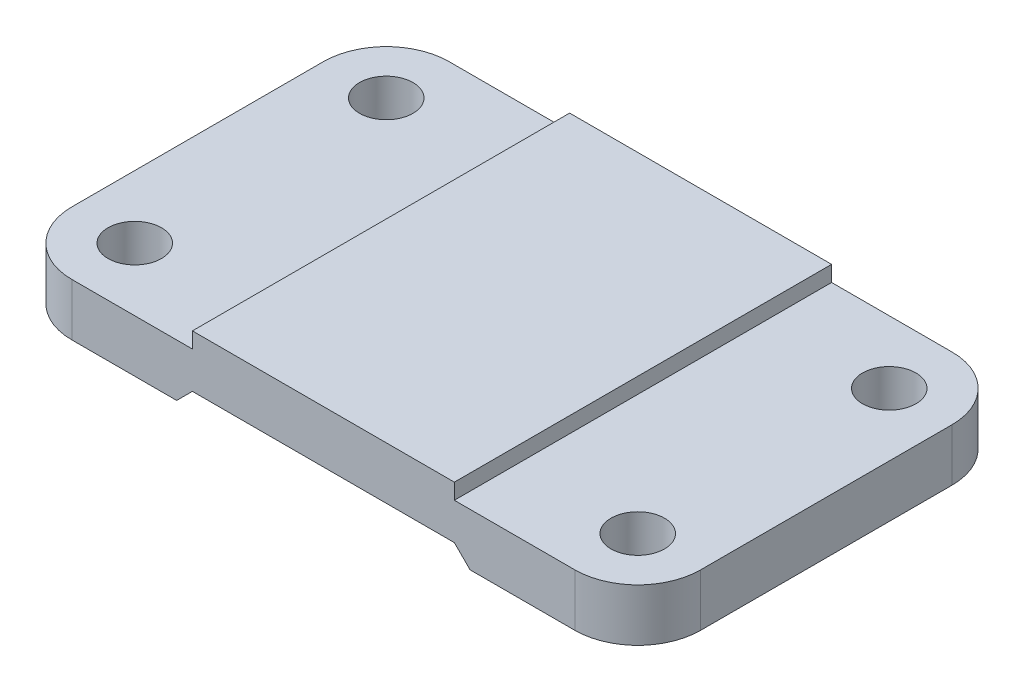
ISO-10303-21;
HEADER;
FILE_DESCRIPTION(('STEP AP214'),'2;1');
FILE_NAME('part.step','',(''),(''),'','','');
FILE_SCHEMA(('AUTOMOTIVE_DESIGN { 1 0 10303 214 1 1 1 1 }'));
ENDSEC;
DATA;
#1=APPLICATION_CONTEXT('core data for automotive mechanical design processes');
#2=APPLICATION_PROTOCOL_DEFINITION('international standard','automotive_design',2000,#1);
#3=PRODUCT_CONTEXT('',#1,'mechanical');
#4=PRODUCT('Part','Part','',(#3));
#5=PRODUCT_RELATED_PRODUCT_CATEGORY('part','',(#4));
#6=PRODUCT_DEFINITION_FORMATION('','',#4);
#7=PRODUCT_DEFINITION_CONTEXT('part definition',#1,'design');
#8=PRODUCT_DEFINITION('design','',#6,#7);
#9=PRODUCT_DEFINITION_SHAPE('','',#8);
#10=(LENGTH_UNIT() NAMED_UNIT(*) SI_UNIT(.MILLI.,.METRE.));
#11=(NAMED_UNIT(*) PLANE_ANGLE_UNIT() SI_UNIT($,.RADIAN.));
#12=(NAMED_UNIT(*) SI_UNIT($,.STERADIAN.) SOLID_ANGLE_UNIT());
#13=UNCERTAINTY_MEASURE_WITH_UNIT(LENGTH_MEASURE(1.E-05),#10,'distance_accuracy_value','');
#14=(GEOMETRIC_REPRESENTATION_CONTEXT(3) GLOBAL_UNCERTAINTY_ASSIGNED_CONTEXT((#13)) GLOBAL_UNIT_ASSIGNED_CONTEXT((#10,
#11,#12)) REPRESENTATION_CONTEXT('',''));
#15=CARTESIAN_POINT('',(0.,0.,0.));
#16=DIRECTION('',(0.,0.,1.));
#17=DIRECTION('',(1.,0.,0.));
#18=AXIS2_PLACEMENT_3D('',#15,#16,#17);
#19=CARTESIAN_POINT('',(0.,3.5,72.));
#20=DIRECTION('',(0.,1.,0.));
#21=DIRECTION('',(-1.,0.,0.));
#22=AXIS2_PLACEMENT_3D('',#19,#20,#21);
#23=PLANE('',#22);
#24=CARTESIAN_POINT('',(-48.,3.5,12.));
#25=DIRECTION('',(0.,1.,0.));
#26=DIRECTION('',(0.,0.,1.));
#27=AXIS2_PLACEMENT_3D('',#24,#25,#26);
#28=CIRCLE('',#27,5.09999999999999);
#29=CARTESIAN_POINT('',(-48.,3.5,17.1));
#30=VERTEX_POINT('',#29);
#31=EDGE_CURVE('E384',#30,#30,#28,.T.);
#32=ORIENTED_EDGE('',*,*,#31,.F.);
#33=EDGE_LOOP('',(#32));
#34=FACE_BOUND('',#33,.T.);
#35=CARTESIAN_POINT('',(-48.,3.5,60.));
#36=DIRECTION('',(0.,1.,0.));
#37=DIRECTION('',(0.,0.,1.));
#38=AXIS2_PLACEMENT_3D('',#35,#36,#37);
#39=CIRCLE('',#38,5.09999999999999);
#40=CARTESIAN_POINT('',(-48.,3.5,65.1));
#41=VERTEX_POINT('',#40);
#42=EDGE_CURVE('E376',#41,#41,#39,.T.);
#43=ORIENTED_EDGE('',*,*,#42,.F.);
#44=EDGE_LOOP('',(#43));
#45=FACE_BOUND('',#44,.T.);
#46=DIRECTION('',(1.,0.,0.));
#47=VECTOR('',#46,1.);
#48=CARTESIAN_POINT('',(0.,3.5,0.));
#49=LINE('',#48,#47);
#50=CARTESIAN_POINT('',(-48.,3.5,0.));
#51=VERTEX_POINT('',#50);
#52=CARTESIAN_POINT('',(-25.,3.5,0.));
#53=VERTEX_POINT('',#52);
#54=EDGE_CURVE('E216',#51,#53,#49,.T.);
#55=ORIENTED_EDGE('',*,*,#54,.F.);
#56=CARTESIAN_POINT('',(-48.,3.5,12.));
#57=DIRECTION('',(0.,1.,0.));
#58=DIRECTION('',(-1.,0.,0.));
#59=AXIS2_PLACEMENT_3D('',#56,#57,#58);
#60=CIRCLE('',#59,12.);
#61=CARTESIAN_POINT('',(-60.,3.5,12.));
#62=VERTEX_POINT('',#61);
#63=EDGE_CURVE('E294',#51,#62,#60,.T.);
#64=ORIENTED_EDGE('',*,*,#63,.T.);
#65=DIRECTION('',(0.,0.,-1.));
#66=VECTOR('',#65,1.);
#67=CARTESIAN_POINT('',(-60.,3.5,72.));
#68=LINE('',#67,#66);
#69=CARTESIAN_POINT('',(-60.,3.5,60.));
#70=VERTEX_POINT('',#69);
#71=EDGE_CURVE('E280',#70,#62,#68,.T.);
#72=ORIENTED_EDGE('',*,*,#71,.F.);
#73=CARTESIAN_POINT('',(-48.,3.5,60.));
#74=DIRECTION('',(0.,1.,0.));
#75=DIRECTION('',(-1.,0.,0.));
#76=AXIS2_PLACEMENT_3D('',#73,#74,#75);
#77=CIRCLE('',#76,12.);
#78=CARTESIAN_POINT('',(-48.,3.5,72.));
#79=VERTEX_POINT('',#78);
#80=EDGE_CURVE('E291',#70,#79,#77,.T.);
#81=ORIENTED_EDGE('',*,*,#80,.T.);
#82=DIRECTION('',(1.,0.,0.));
#83=VECTOR('',#82,1.);
#84=CARTESIAN_POINT('',(0.,3.5,72.));
#85=LINE('',#84,#83);
#86=CARTESIAN_POINT('',(-25.,3.5,72.));
#87=VERTEX_POINT('',#86);
#88=EDGE_CURVE('E173',#79,#87,#85,.T.);
#89=ORIENTED_EDGE('',*,*,#88,.T.);
#90=DIRECTION('',(0.,0.,-1.));
#91=VECTOR('',#90,1.);
#92=CARTESIAN_POINT('',(-25.,3.5,72.));
#93=LINE('',#92,#91);
#94=EDGE_CURVE('E215',#87,#53,#93,.T.);
#95=ORIENTED_EDGE('',*,*,#94,.T.);
#96=EDGE_LOOP('',(#55,#64,#72,#81,#89,#95));
#97=FACE_BOUND('',#96,.T.);
#98=ADVANCED_FACE('F47',(#34,#45,#97),#23,.T.);
#99=CARTESIAN_POINT('',(-60.,0.,72.));
#100=DIRECTION('',(-1.,0.,0.));
#101=DIRECTION('',(0.,0.,1.));
#102=AXIS2_PLACEMENT_3D('',#99,#100,#101);
#103=PLANE('',#102);
#104=ORIENTED_EDGE('',*,*,#71,.T.);
#105=DIRECTION('',(0.,1.,0.));
#106=VECTOR('',#105,1.);
#107=CARTESIAN_POINT('',(-60.,-6.5,12.));
#108=LINE('',#107,#106);
#109=CARTESIAN_POINT('',(-60.,-6.5,12.));
#110=VERTEX_POINT('',#109);
#111=EDGE_CURVE('E301',#62,#110,#108,.F.);
#112=ORIENTED_EDGE('',*,*,#111,.T.);
#113=DIRECTION('',(0.,0.,-1.));
#114=VECTOR('',#113,1.);
#115=CARTESIAN_POINT('',(-60.,-6.5,72.));
#116=LINE('',#115,#114);
#117=CARTESIAN_POINT('',(-60.,-6.5,60.));
#118=VERTEX_POINT('',#117);
#119=EDGE_CURVE('E184',#118,#110,#116,.T.);
#120=ORIENTED_EDGE('',*,*,#119,.F.);
#121=DIRECTION('',(0.,1.,0.));
#122=VECTOR('',#121,1.);
#123=CARTESIAN_POINT('',(-60.,0.,60.));
#124=LINE('',#123,#122);
#125=EDGE_CURVE('E297',#118,#70,#124,.T.);
#126=ORIENTED_EDGE('',*,*,#125,.T.);
#127=EDGE_LOOP('',(#104,#112,#120,#126));
#128=FACE_BOUND('',#127,.T.);
#129=ADVANCED_FACE('F395',(#128),#103,.T.);
#130=CARTESIAN_POINT('',(0.,-6.5,72.));
#131=DIRECTION('',(0.,1.,0.));
#132=DIRECTION('',(-1.,0.,0.));
#133=AXIS2_PLACEMENT_3D('',#130,#131,#132);
#134=PLANE('',#133);
#135=CARTESIAN_POINT('',(-48.,-6.5,12.));
#136=DIRECTION('',(0.,1.,0.));
#137=DIRECTION('',(-1.,0.,0.));
#138=AXIS2_PLACEMENT_3D('',#135,#136,#137);
#139=CIRCLE('',#138,5.09999999999999);
#140=CARTESIAN_POINT('',(-53.1,-6.5,12.));
#141=VERTEX_POINT('',#140);
#142=EDGE_CURVE('E380',#141,#141,#139,.T.);
#143=ORIENTED_EDGE('',*,*,#142,.T.);
#144=EDGE_LOOP('',(#143));
#145=FACE_BOUND('',#144,.T.);
#146=CARTESIAN_POINT('',(-48.,-6.5,60.));
#147=DIRECTION('',(0.,1.,0.));
#148=DIRECTION('',(-1.,0.,0.));
#149=AXIS2_PLACEMENT_3D('',#146,#147,#148);
#150=CIRCLE('',#149,5.09999999999999);
#151=CARTESIAN_POINT('',(-53.1,-6.5,60.));
#152=VERTEX_POINT('',#151);
#153=EDGE_CURVE('E372',#152,#152,#150,.T.);
#154=ORIENTED_EDGE('',*,*,#153,.T.);
#155=EDGE_LOOP('',(#154));
#156=FACE_BOUND('',#155,.T.);
#157=ORIENTED_EDGE('',*,*,#119,.T.);
#158=CARTESIAN_POINT('',(-48.,-6.5,12.));
#159=DIRECTION('',(0.,1.,0.));
#160=DIRECTION('',(-1.,0.,0.));
#161=AXIS2_PLACEMENT_3D('',#158,#159,#160);
#162=CIRCLE('',#161,12.);
#163=CARTESIAN_POINT('',(-48.,-6.5,0.));
#164=VERTEX_POINT('',#163);
#165=EDGE_CURVE('E307',#110,#164,#162,.F.);
#166=ORIENTED_EDGE('',*,*,#165,.T.);
#167=DIRECTION('',(1.,0.,0.));
#168=VECTOR('',#167,1.);
#169=CARTESIAN_POINT('',(0.,-6.5,0.));
#170=LINE('',#169,#168);
#171=CARTESIAN_POINT('',(-28.,-6.5,0.));
#172=VERTEX_POINT('',#171);
#173=EDGE_CURVE('E180',#164,#172,#170,.T.);
#174=ORIENTED_EDGE('',*,*,#173,.T.);
#175=DIRECTION('',(0.,0.,-1.));
#176=VECTOR('',#175,1.);
#177=CARTESIAN_POINT('',(-28.,-6.5,72.));
#178=LINE('',#177,#176);
#179=CARTESIAN_POINT('',(-28.,-6.5,72.));
#180=VERTEX_POINT('',#179);
#181=EDGE_CURVE('E176',#180,#172,#178,.T.);
#182=ORIENTED_EDGE('',*,*,#181,.F.);
#183=DIRECTION('',(1.,0.,0.));
#184=VECTOR('',#183,1.);
#185=CARTESIAN_POINT('',(0.,-6.5,72.));
#186=LINE('',#185,#184);
#187=CARTESIAN_POINT('',(-48.,-6.5,72.));
#188=VERTEX_POINT('',#187);
#189=EDGE_CURVE('E162',#188,#180,#186,.T.);
#190=ORIENTED_EDGE('',*,*,#189,.F.);
#191=CARTESIAN_POINT('',(-48.,-6.5,60.));
#192=DIRECTION('',(0.,1.,0.));
#193=DIRECTION('',(-1.,0.,0.));
#194=AXIS2_PLACEMENT_3D('',#191,#192,#193);
#195=CIRCLE('',#194,12.);
#196=EDGE_CURVE('E304',#188,#118,#195,.F.);
#197=ORIENTED_EDGE('',*,*,#196,.T.);
#198=EDGE_LOOP('',(#157,#166,#174,#182,#190,#197));
#199=FACE_BOUND('',#198,.T.);
#200=ADVANCED_FACE('F178',(#145,#156,#199),#134,.F.);
#201=CARTESIAN_POINT('',(-10.7500000000001,10.75,72.));
#202=DIRECTION('',(-0.707106781186551,0.707106781186544,0.));
#203=DIRECTION('',(-0.707106781186544,-0.707106781186551,0.));
#204=AXIS2_PLACEMENT_3D('',#201,#202,#203);
#205=PLANE('',#204);
#206=DIRECTION('',(0.707106781186544,0.707106781186551,0.));
#207=VECTOR('',#206,1.);
#208=CARTESIAN_POINT('',(-10.7500000000001,10.75,0.));
#209=LINE('',#208,#207);
#210=CARTESIAN_POINT('',(-25.,-3.49999999999999,0.));
#211=VERTEX_POINT('',#210);
#212=EDGE_CURVE('E223',#172,#211,#209,.T.);
#213=ORIENTED_EDGE('',*,*,#212,.T.);
#214=DIRECTION('',(0.,0.,-1.));
#215=VECTOR('',#214,1.);
#216=CARTESIAN_POINT('',(-25.,-3.49999999999999,72.));
#217=LINE('',#216,#215);
#218=CARTESIAN_POINT('',(-25.,-3.49999999999999,72.));
#219=VERTEX_POINT('',#218);
#220=EDGE_CURVE('E185',#219,#211,#217,.T.);
#221=ORIENTED_EDGE('',*,*,#220,.F.);
#222=DIRECTION('',(0.707106781186544,0.707106781186551,0.));
#223=VECTOR('',#222,1.);
#224=CARTESIAN_POINT('',(-10.7500000000001,10.75,72.));
#225=LINE('',#224,#223);
#226=EDGE_CURVE('E167',#180,#219,#225,.T.);
#227=ORIENTED_EDGE('',*,*,#226,.F.);
#228=ORIENTED_EDGE('',*,*,#181,.T.);
#229=EDGE_LOOP('',(#213,#221,#227,#228));
#230=FACE_BOUND('',#229,.T.);
#231=ADVANCED_FACE('F187',(#230),#205,.F.);
#232=CARTESIAN_POINT('',(0.,-3.49999999999999,72.));
#233=DIRECTION('',(0.,1.,0.));
#234=DIRECTION('',(-1.,0.,0.));
#235=AXIS2_PLACEMENT_3D('',#232,#233,#234);
#236=PLANE('',#235);
#237=DIRECTION('',(1.,0.,0.));
#238=VECTOR('',#237,1.);
#239=CARTESIAN_POINT('',(0.,-3.49999999999999,0.));
#240=LINE('',#239,#238);
#241=CARTESIAN_POINT('',(25.,-3.49999999999999,0.));
#242=VERTEX_POINT('',#241);
#243=EDGE_CURVE('E226',#211,#242,#240,.T.);
#244=ORIENTED_EDGE('',*,*,#243,.T.);
#245=DIRECTION('',(0.,0.,-1.));
#246=VECTOR('',#245,1.);
#247=CARTESIAN_POINT('',(25.,-3.49999999999999,72.));
#248=LINE('',#247,#246);
#249=CARTESIAN_POINT('',(25.,-3.49999999999999,72.));
#250=VERTEX_POINT('',#249);
#251=EDGE_CURVE('E272',#250,#242,#248,.T.);
#252=ORIENTED_EDGE('',*,*,#251,.F.);
#253=DIRECTION('',(1.,0.,0.));
#254=VECTOR('',#253,1.);
#255=CARTESIAN_POINT('',(0.,-3.49999999999999,72.));
#256=LINE('',#255,#254);
#257=EDGE_CURVE('E191',#219,#250,#256,.T.);
#258=ORIENTED_EDGE('',*,*,#257,.F.);
#259=ORIENTED_EDGE('',*,*,#220,.T.);
#260=EDGE_LOOP('',(#244,#252,#258,#259));
#261=FACE_BOUND('',#260,.T.);
#262=ADVANCED_FACE('F413',(#261),#236,.F.);
#263=CARTESIAN_POINT('',(10.75,10.75,72.));
#264=DIRECTION('',(0.707106781186549,0.707106781186546,0.));
#265=DIRECTION('',(-0.707106781186546,0.707106781186549,0.));
#266=AXIS2_PLACEMENT_3D('',#263,#264,#265);
#267=PLANE('',#266);
#268=DIRECTION('',(0.707106781186546,-0.707106781186549,0.));
#269=VECTOR('',#268,1.);
#270=CARTESIAN_POINT('',(10.75,10.75,0.));
#271=LINE('',#270,#269);
#272=CARTESIAN_POINT('',(28.,-6.49999999999999,0.));
#273=VERTEX_POINT('',#272);
#274=EDGE_CURVE('E229',#242,#273,#271,.T.);
#275=ORIENTED_EDGE('',*,*,#274,.T.);
#276=DIRECTION('',(0.,0.,-1.));
#277=VECTOR('',#276,1.);
#278=CARTESIAN_POINT('',(28.,-6.49999999999999,72.));
#279=LINE('',#278,#277);
#280=CARTESIAN_POINT('',(28.,-6.49999999999999,72.));
#281=VERTEX_POINT('',#280);
#282=EDGE_CURVE('E268',#281,#273,#279,.T.);
#283=ORIENTED_EDGE('',*,*,#282,.F.);
#284=DIRECTION('',(0.707106781186546,-0.707106781186549,0.));
#285=VECTOR('',#284,1.);
#286=CARTESIAN_POINT('',(10.75,10.75,72.));
#287=LINE('',#286,#285);
#288=EDGE_CURVE('E194',#250,#281,#287,.T.);
#289=ORIENTED_EDGE('',*,*,#288,.F.);
#290=ORIENTED_EDGE('',*,*,#251,.T.);
#291=EDGE_LOOP('',(#275,#283,#289,#290));
#292=FACE_BOUND('',#291,.T.);
#293=ADVANCED_FACE('F444',(#292),#267,.F.);
#294=CARTESIAN_POINT('',(0.,-6.49999999999998,72.));
#295=DIRECTION('',(0.,1.,0.));
#296=DIRECTION('',(-1.,0.,0.));
#297=AXIS2_PLACEMENT_3D('',#294,#295,#296);
#298=PLANE('',#297);
#299=CARTESIAN_POINT('',(48.,-6.5,60.));
#300=DIRECTION('',(0.,1.,0.));
#301=DIRECTION('',(-1.,0.,0.));
#302=AXIS2_PLACEMENT_3D('',#299,#300,#301);
#303=CIRCLE('',#302,5.09999999999999);
#304=CARTESIAN_POINT('',(42.9,-6.5,60.));
#305=VERTEX_POINT('',#304);
#306=EDGE_CURVE('E364',#305,#305,#303,.T.);
#307=ORIENTED_EDGE('',*,*,#306,.T.);
#308=EDGE_LOOP('',(#307));
#309=FACE_BOUND('',#308,.T.);
#310=CARTESIAN_POINT('',(48.,-6.5,12.));
#311=DIRECTION('',(0.,1.,0.));
#312=DIRECTION('',(-1.,0.,0.));
#313=AXIS2_PLACEMENT_3D('',#310,#311,#312);
#314=CIRCLE('',#313,5.09999999999999);
#315=CARTESIAN_POINT('',(42.9,-6.5,12.));
#316=VERTEX_POINT('',#315);
#317=EDGE_CURVE('E219',#316,#316,#314,.T.);
#318=ORIENTED_EDGE('',*,*,#317,.T.);
#319=EDGE_LOOP('',(#318));
#320=FACE_BOUND('',#319,.T.);
#321=DIRECTION('',(1.,0.,0.));
#322=VECTOR('',#321,1.);
#323=CARTESIAN_POINT('',(0.,-6.49999999999998,0.));
#324=LINE('',#323,#322);
#325=CARTESIAN_POINT('',(48.,-6.5,0.));
#326=VERTEX_POINT('',#325);
#327=EDGE_CURVE('E232',#273,#326,#324,.T.);
#328=ORIENTED_EDGE('',*,*,#327,.T.);
#329=CARTESIAN_POINT('',(48.,-6.5,12.));
#330=DIRECTION('',(0.,1.,0.));
#331=DIRECTION('',(-1.,0.,0.));
#332=AXIS2_PLACEMENT_3D('',#329,#330,#331);
#333=CIRCLE('',#332,12.);
#334=CARTESIAN_POINT('',(60.,-6.5,12.));
#335=VERTEX_POINT('',#334);
#336=EDGE_CURVE('E324',#326,#335,#333,.F.);
#337=ORIENTED_EDGE('',*,*,#336,.T.);
#338=DIRECTION('',(0.,0.,-1.));
#339=VECTOR('',#338,1.);
#340=CARTESIAN_POINT('',(60.,-6.5,72.));
#341=LINE('',#340,#339);
#342=CARTESIAN_POINT('',(60.,-6.5,60.));
#343=VERTEX_POINT('',#342);
#344=EDGE_CURVE('E264',#343,#335,#341,.T.);
#345=ORIENTED_EDGE('',*,*,#344,.F.);
#346=CARTESIAN_POINT('',(48.,-6.5,60.));
#347=DIRECTION('',(0.,1.,0.));
#348=DIRECTION('',(-1.,0.,0.));
#349=AXIS2_PLACEMENT_3D('',#346,#347,#348);
#350=CIRCLE('',#349,12.);
#351=CARTESIAN_POINT('',(48.,-6.5,72.));
#352=VERTEX_POINT('',#351);
#353=EDGE_CURVE('E63',#343,#352,#350,.F.);
#354=ORIENTED_EDGE('',*,*,#353,.T.);
#355=DIRECTION('',(1.,0.,0.));
#356=VECTOR('',#355,1.);
#357=CARTESIAN_POINT('',(0.,-6.49999999999998,72.));
#358=LINE('',#357,#356);
#359=EDGE_CURVE('E200',#281,#352,#358,.T.);
#360=ORIENTED_EDGE('',*,*,#359,.F.);
#361=ORIENTED_EDGE('',*,*,#282,.T.);
#362=EDGE_LOOP('',(#328,#337,#345,#354,#360,#361));
#363=FACE_BOUND('',#362,.T.);
#364=ADVANCED_FACE('F446',(#309,#320,#363),#298,.F.);
#365=CARTESIAN_POINT('',(60.,0.,72.));
#366=DIRECTION('',(-1.,0.,0.));
#367=DIRECTION('',(0.,0.,1.));
#368=AXIS2_PLACEMENT_3D('',#365,#366,#367);
#369=PLANE('',#368);
#370=ORIENTED_EDGE('',*,*,#344,.T.);
#371=DIRECTION('',(0.,1.,0.));
#372=VECTOR('',#371,1.);
#373=CARTESIAN_POINT('',(60.,0.,12.));
#374=LINE('',#373,#372);
#375=CARTESIAN_POINT('',(60.,3.50000000000001,12.));
#376=VERTEX_POINT('',#375);
#377=EDGE_CURVE('E313',#335,#376,#374,.T.);
#378=ORIENTED_EDGE('',*,*,#377,.T.);
#379=DIRECTION('',(0.,0.,-1.));
#380=VECTOR('',#379,1.);
#381=CARTESIAN_POINT('',(60.,3.50000000000001,72.));
#382=LINE('',#381,#380);
#383=CARTESIAN_POINT('',(60.,3.50000000000001,60.));
#384=VERTEX_POINT('',#383);
#385=EDGE_CURVE('E260',#384,#376,#382,.T.);
#386=ORIENTED_EDGE('',*,*,#385,.F.);
#387=DIRECTION('',(0.,1.,0.));
#388=VECTOR('',#387,1.);
#389=CARTESIAN_POINT('',(60.,-6.5,60.));
#390=LINE('',#389,#388);
#391=EDGE_CURVE('E310',#384,#343,#390,.F.);
#392=ORIENTED_EDGE('',*,*,#391,.T.);
#393=EDGE_LOOP('',(#370,#378,#386,#392));
#394=FACE_BOUND('',#393,.T.);
#395=ADVANCED_FACE('F449',(#394),#369,.F.);
#396=CARTESIAN_POINT('',(48.,3.50000000000001,60.));
#397=DIRECTION('',(0.,1.,0.));
#398=DIRECTION('',(0.,0.,1.));
#399=AXIS2_PLACEMENT_3D('',#396,#397,#398);
#400=CIRCLE('',#399,5.09999999999999);
#401=CARTESIAN_POINT('',(48.,3.50000000000001,65.1));
#402=VERTEX_POINT('',#401);
#403=EDGE_CURVE('E368',#402,#402,#400,.T.);
#404=ORIENTED_EDGE('',*,*,#403,.F.);
#405=EDGE_LOOP('',(#404));
#406=FACE_BOUND('',#405,.T.);
#407=CARTESIAN_POINT('',(48.,3.50000000000001,12.));
#408=DIRECTION('',(0.,1.,0.));
#409=DIRECTION('',(0.,0.,1.));
#410=AXIS2_PLACEMENT_3D('',#407,#408,#409);
#411=CIRCLE('',#410,5.09999999999999);
#412=CARTESIAN_POINT('',(48.,3.50000000000001,17.1));
#413=VERTEX_POINT('',#412);
#414=EDGE_CURVE('E361',#413,#413,#411,.T.);
#415=ORIENTED_EDGE('',*,*,#414,.F.);
#416=EDGE_LOOP('',(#415));
#417=FACE_BOUND('',#416,.T.);
#418=ORIENTED_EDGE('',*,*,#385,.T.);
#419=CARTESIAN_POINT('',(48.,3.50000000000001,12.));
#420=DIRECTION('',(0.,1.,0.));
#421=DIRECTION('',(-1.,0.,0.));
#422=AXIS2_PLACEMENT_3D('',#419,#420,#421);
#423=CIRCLE('',#422,12.);
#424=CARTESIAN_POINT('',(48.,3.50000000000001,0.));
#425=VERTEX_POINT('',#424);
#426=EDGE_CURVE('E319',#376,#425,#423,.T.);
#427=ORIENTED_EDGE('',*,*,#426,.T.);
#428=CARTESIAN_POINT('',(25.,3.50000000000001,0.));
#429=VERTEX_POINT('',#428);
#430=EDGE_CURVE('E220',#429,#425,#49,.T.);
#431=ORIENTED_EDGE('',*,*,#430,.F.);
#432=DIRECTION('',(0.,0.,-1.));
#433=VECTOR('',#432,1.);
#434=CARTESIAN_POINT('',(25.,3.50000000000001,72.));
#435=LINE('',#434,#433);
#436=CARTESIAN_POINT('',(25.,3.50000000000001,72.));
#437=VERTEX_POINT('',#436);
#438=EDGE_CURVE('E257',#437,#429,#435,.T.);
#439=ORIENTED_EDGE('',*,*,#438,.F.);
#440=CARTESIAN_POINT('',(48.,3.50000000000001,72.));
#441=VERTEX_POINT('',#440);
#442=EDGE_CURVE('E203',#437,#441,#85,.T.);
#443=ORIENTED_EDGE('',*,*,#442,.T.);
#444=CARTESIAN_POINT('',(48.,3.50000000000001,60.));
#445=DIRECTION('',(0.,1.,0.));
#446=DIRECTION('',(-1.,0.,0.));
#447=AXIS2_PLACEMENT_3D('',#444,#445,#446);
#448=CIRCLE('',#447,12.);
#449=EDGE_CURVE('E71',#441,#384,#448,.T.);
#450=ORIENTED_EDGE('',*,*,#449,.T.);
#451=EDGE_LOOP('',(#418,#427,#431,#439,#443,#450));
#452=FACE_BOUND('',#451,.T.);
#453=ADVANCED_FACE('F330',(#406,#417,#452),#23,.T.);
#454=CARTESIAN_POINT('',(25.,0.,72.));
#455=DIRECTION('',(-1.,0.,0.));
#456=DIRECTION('',(0.,0.,1.));
#457=AXIS2_PLACEMENT_3D('',#454,#455,#456);
#458=PLANE('',#457);
#459=DIRECTION('',(0.,1.,0.));
#460=VECTOR('',#459,1.);
#461=CARTESIAN_POINT('',(25.,0.,0.));
#462=LINE('',#461,#460);
#463=CARTESIAN_POINT('',(25.,6.50000000000001,0.));
#464=VERTEX_POINT('',#463);
#465=EDGE_CURVE('E236',#429,#464,#462,.T.);
#466=ORIENTED_EDGE('',*,*,#465,.T.);
#467=DIRECTION('',(0.,0.,-1.));
#468=VECTOR('',#467,1.);
#469=CARTESIAN_POINT('',(25.,6.50000000000001,72.));
#470=LINE('',#469,#468);
#471=CARTESIAN_POINT('',(25.,6.50000000000001,72.));
#472=VERTEX_POINT('',#471);
#473=EDGE_CURVE('E254',#472,#464,#470,.T.);
#474=ORIENTED_EDGE('',*,*,#473,.F.);
#475=DIRECTION('',(0.,1.,0.));
#476=VECTOR('',#475,1.);
#477=CARTESIAN_POINT('',(25.,0.,72.));
#478=LINE('',#477,#476);
#479=EDGE_CURVE('E204',#437,#472,#478,.T.);
#480=ORIENTED_EDGE('',*,*,#479,.F.);
#481=ORIENTED_EDGE('',*,*,#438,.T.);
#482=EDGE_LOOP('',(#466,#474,#480,#481));
#483=FACE_BOUND('',#482,.T.);
#484=ADVANCED_FACE('F354',(#483),#458,.F.);
#485=CARTESIAN_POINT('',(0.,6.5,72.));
#486=DIRECTION('',(0.,1.,0.));
#487=DIRECTION('',(-1.,0.,0.));
#488=AXIS2_PLACEMENT_3D('',#485,#486,#487);
#489=PLANE('',#488);
#490=DIRECTION('',(1.,0.,0.));
#491=VECTOR('',#490,1.);
#492=CARTESIAN_POINT('',(0.,6.5,0.));
#493=LINE('',#492,#491);
#494=CARTESIAN_POINT('',(-25.,6.5,0.));
#495=VERTEX_POINT('',#494);
#496=EDGE_CURVE('E240',#495,#464,#493,.T.);
#497=ORIENTED_EDGE('',*,*,#496,.F.);
#498=DIRECTION('',(0.,0.,-1.));
#499=VECTOR('',#498,1.);
#500=CARTESIAN_POINT('',(-25.,6.5,72.));
#501=LINE('',#500,#499);
#502=CARTESIAN_POINT('',(-25.,6.5,72.));
#503=VERTEX_POINT('',#502);
#504=EDGE_CURVE('E251',#503,#495,#501,.T.);
#505=ORIENTED_EDGE('',*,*,#504,.F.);
#506=DIRECTION('',(1.,0.,0.));
#507=VECTOR('',#506,1.);
#508=CARTESIAN_POINT('',(0.,6.5,72.));
#509=LINE('',#508,#507);
#510=EDGE_CURVE('E207',#503,#472,#509,.T.);
#511=ORIENTED_EDGE('',*,*,#510,.T.);
#512=ORIENTED_EDGE('',*,*,#473,.T.);
#513=EDGE_LOOP('',(#497,#505,#511,#512));
#514=FACE_BOUND('',#513,.T.);
#515=ADVANCED_FACE('F351',(#514),#489,.T.);
#516=CARTESIAN_POINT('',(-25.,0.,72.));
#517=DIRECTION('',(1.,0.,0.));
#518=DIRECTION('',(0.,0.,-1.));
#519=AXIS2_PLACEMENT_3D('',#516,#517,#518);
#520=PLANE('',#519);
#521=DIRECTION('',(0.,-1.,0.));
#522=VECTOR('',#521,1.);
#523=CARTESIAN_POINT('',(-25.,0.,0.));
#524=LINE('',#523,#522);
#525=EDGE_CURVE('E244',#495,#53,#524,.T.);
#526=ORIENTED_EDGE('',*,*,#525,.T.);
#527=ORIENTED_EDGE('',*,*,#94,.F.);
#528=DIRECTION('',(0.,-1.,0.));
#529=VECTOR('',#528,1.);
#530=CARTESIAN_POINT('',(-25.,0.,72.));
#531=LINE('',#530,#529);
#532=EDGE_CURVE('E211',#503,#87,#531,.T.);
#533=ORIENTED_EDGE('',*,*,#532,.F.);
#534=ORIENTED_EDGE('',*,*,#504,.T.);
#535=EDGE_LOOP('',(#526,#527,#533,#534));
#536=FACE_BOUND('',#535,.T.);
#537=ADVANCED_FACE('F344',(#536),#520,.F.);
#538=CARTESIAN_POINT('',(0.,0.,72.));
#539=DIRECTION('',(0.,0.,1.));
#540=DIRECTION('',(1.,0.,0.));
#541=AXIS2_PLACEMENT_3D('',#538,#539,#540);
#542=PLANE('',#541);
#543=ORIENTED_EDGE('',*,*,#88,.F.);
#544=DIRECTION('',(0.,1.,0.));
#545=VECTOR('',#544,1.);
#546=CARTESIAN_POINT('',(-48.,0.,72.));
#547=LINE('',#546,#545);
#548=EDGE_CURVE('E11',#79,#188,#547,.F.);
#549=ORIENTED_EDGE('',*,*,#548,.T.);
#550=ORIENTED_EDGE('',*,*,#189,.T.);
#551=ORIENTED_EDGE('',*,*,#226,.T.);
#552=ORIENTED_EDGE('',*,*,#257,.T.);
#553=ORIENTED_EDGE('',*,*,#288,.T.);
#554=ORIENTED_EDGE('',*,*,#359,.T.);
#555=DIRECTION('',(0.,1.,0.));
#556=VECTOR('',#555,1.);
#557=CARTESIAN_POINT('',(48.,3.50000000000001,72.));
#558=LINE('',#557,#556);
#559=EDGE_CURVE('E56',#352,#441,#558,.T.);
#560=ORIENTED_EDGE('',*,*,#559,.T.);
#561=ORIENTED_EDGE('',*,*,#442,.F.);
#562=ORIENTED_EDGE('',*,*,#479,.T.);
#563=ORIENTED_EDGE('',*,*,#510,.F.);
#564=ORIENTED_EDGE('',*,*,#532,.T.);
#565=EDGE_LOOP('',(#543,#549,#550,#551,#552,#553,#554,#560,#561,#562,#563,#564));
#566=FACE_BOUND('',#565,.T.);
#567=ADVANCED_FACE('F165',(#566),#542,.T.);
#568=CARTESIAN_POINT('',(0.,0.,0.));
#569=DIRECTION('',(0.,0.,1.));
#570=DIRECTION('',(1.,0.,0.));
#571=AXIS2_PLACEMENT_3D('',#568,#569,#570);
#572=PLANE('',#571);
#573=ORIENTED_EDGE('',*,*,#173,.F.);
#574=DIRECTION('',(0.,1.,0.));
#575=VECTOR('',#574,1.);
#576=CARTESIAN_POINT('',(-48.,3.5,0.));
#577=LINE('',#576,#575);
#578=EDGE_CURVE('E287',#164,#51,#577,.T.);
#579=ORIENTED_EDGE('',*,*,#578,.T.);
#580=ORIENTED_EDGE('',*,*,#54,.T.);
#581=ORIENTED_EDGE('',*,*,#525,.F.);
#582=ORIENTED_EDGE('',*,*,#496,.T.);
#583=ORIENTED_EDGE('',*,*,#465,.F.);
#584=ORIENTED_EDGE('',*,*,#430,.T.);
#585=DIRECTION('',(0.,1.,0.));
#586=VECTOR('',#585,1.);
#587=CARTESIAN_POINT('',(48.,0.,0.));
#588=LINE('',#587,#586);
#589=EDGE_CURVE('E284',#425,#326,#588,.F.);
#590=ORIENTED_EDGE('',*,*,#589,.T.);
#591=ORIENTED_EDGE('',*,*,#327,.F.);
#592=ORIENTED_EDGE('',*,*,#274,.F.);
#593=ORIENTED_EDGE('',*,*,#243,.F.);
#594=ORIENTED_EDGE('',*,*,#212,.F.);
#595=EDGE_LOOP('',(#573,#579,#580,#581,#582,#583,#584,#590,#591,#592,#593,#594));
#596=FACE_BOUND('',#595,.T.);
#597=ADVANCED_FACE('F348',(#596),#572,.F.);
#598=CARTESIAN_POINT('',(48.,3.50000000000001,12.));
#599=DIRECTION('',(0.,1.,0.));
#600=DIRECTION('',(0.,0.,1.));
#601=AXIS2_PLACEMENT_3D('',#598,#599,#600);
#602=CYLINDRICAL_SURFACE('',#601,5.09999999999999);
#603=ORIENTED_EDGE('',*,*,#414,.T.);
#604=EDGE_LOOP('',(#603));
#605=FACE_BOUND('',#604,.T.);
#606=ORIENTED_EDGE('',*,*,#317,.F.);
#607=EDGE_LOOP('',(#606));
#608=FACE_BOUND('',#607,.T.);
#609=ADVANCED_FACE('F507',(#605,#608),#602,.F.);
#610=CARTESIAN_POINT('',(48.,3.50000000000001,60.));
#611=DIRECTION('',(0.,1.,0.));
#612=DIRECTION('',(0.,0.,1.));
#613=AXIS2_PLACEMENT_3D('',#610,#611,#612);
#614=CYLINDRICAL_SURFACE('',#613,5.09999999999999);
#615=ORIENTED_EDGE('',*,*,#403,.T.);
#616=EDGE_LOOP('',(#615));
#617=FACE_BOUND('',#616,.T.);
#618=ORIENTED_EDGE('',*,*,#306,.F.);
#619=EDGE_LOOP('',(#618));
#620=FACE_BOUND('',#619,.T.);
#621=ADVANCED_FACE('F402',(#617,#620),#614,.F.);
#622=CARTESIAN_POINT('',(-48.,3.5,60.));
#623=DIRECTION('',(0.,1.,0.));
#624=DIRECTION('',(0.,0.,1.));
#625=AXIS2_PLACEMENT_3D('',#622,#623,#624);
#626=CYLINDRICAL_SURFACE('',#625,5.09999999999999);
#627=ORIENTED_EDGE('',*,*,#42,.T.);
#628=EDGE_LOOP('',(#627));
#629=FACE_BOUND('',#628,.T.);
#630=ORIENTED_EDGE('',*,*,#153,.F.);
#631=EDGE_LOOP('',(#630));
#632=FACE_BOUND('',#631,.T.);
#633=ADVANCED_FACE('F399',(#629,#632),#626,.F.);
#634=CARTESIAN_POINT('',(-48.,3.5,12.));
#635=DIRECTION('',(0.,1.,0.));
#636=DIRECTION('',(0.,0.,1.));
#637=AXIS2_PLACEMENT_3D('',#634,#635,#636);
#638=CYLINDRICAL_SURFACE('',#637,5.09999999999999);
#639=ORIENTED_EDGE('',*,*,#31,.T.);
#640=EDGE_LOOP('',(#639));
#641=FACE_BOUND('',#640,.T.);
#642=ORIENTED_EDGE('',*,*,#142,.F.);
#643=EDGE_LOOP('',(#642));
#644=FACE_BOUND('',#643,.T.);
#645=ADVANCED_FACE('F390',(#641,#644),#638,.F.);
#646=CARTESIAN_POINT('',(-48.,0.,12.));
#647=DIRECTION('',(0.,-1.,0.));
#648=DIRECTION('',(0.,0.,-1.));
#649=AXIS2_PLACEMENT_3D('',#646,#647,#648);
#650=CYLINDRICAL_SURFACE('',#649,12.);
#651=ORIENTED_EDGE('',*,*,#165,.F.);
#652=ORIENTED_EDGE('',*,*,#111,.F.);
#653=ORIENTED_EDGE('',*,*,#63,.F.);
#654=ORIENTED_EDGE('',*,*,#578,.F.);
#655=EDGE_LOOP('',(#651,#652,#653,#654));
#656=FACE_BOUND('',#655,.T.);
#657=ADVANCED_FACE('F419',(#656),#650,.T.);
#658=CARTESIAN_POINT('',(48.,0.,12.));
#659=DIRECTION('',(0.,1.,0.));
#660=DIRECTION('',(0.,0.,1.));
#661=AXIS2_PLACEMENT_3D('',#658,#659,#660);
#662=CYLINDRICAL_SURFACE('',#661,12.);
#663=ORIENTED_EDGE('',*,*,#336,.F.);
#664=ORIENTED_EDGE('',*,*,#589,.F.);
#665=ORIENTED_EDGE('',*,*,#426,.F.);
#666=ORIENTED_EDGE('',*,*,#377,.F.);
#667=EDGE_LOOP('',(#663,#664,#665,#666));
#668=FACE_BOUND('',#667,.T.);
#669=ADVANCED_FACE('F422',(#668),#662,.T.);
#670=CARTESIAN_POINT('',(-48.,0.,60.));
#671=DIRECTION('',(0.,1.,0.));
#672=DIRECTION('',(0.,0.,1.));
#673=AXIS2_PLACEMENT_3D('',#670,#671,#672);
#674=CYLINDRICAL_SURFACE('',#673,12.);
#675=ORIENTED_EDGE('',*,*,#196,.F.);
#676=ORIENTED_EDGE('',*,*,#548,.F.);
#677=ORIENTED_EDGE('',*,*,#80,.F.);
#678=ORIENTED_EDGE('',*,*,#125,.F.);
#679=EDGE_LOOP('',(#675,#676,#677,#678));
#680=FACE_BOUND('',#679,.T.);
#681=ADVANCED_FACE('F425',(#680),#674,.T.);
#682=CARTESIAN_POINT('',(48.,0.,60.));
#683=DIRECTION('',(0.,-1.,0.));
#684=DIRECTION('',(0.,0.,-1.));
#685=AXIS2_PLACEMENT_3D('',#682,#683,#684);
#686=CYLINDRICAL_SURFACE('',#685,12.);
#687=ORIENTED_EDGE('',*,*,#353,.F.);
#688=ORIENTED_EDGE('',*,*,#391,.F.);
#689=ORIENTED_EDGE('',*,*,#449,.F.);
#690=ORIENTED_EDGE('',*,*,#559,.F.);
#691=EDGE_LOOP('',(#687,#688,#689,#690));
#692=FACE_BOUND('',#691,.T.);
#693=ADVANCED_FACE('F49',(#692),#686,.T.);
#694=CLOSED_SHELL('',(#98,#129,#200,#231,#262,#293,#364,#395,#453,#484,#515,#537,#567,#597,#609,
#621,#633,#645,#657,#669,#681,#693));
#695=MANIFOLD_SOLID_BREP('B2',#694);
#696=ADVANCED_BREP_SHAPE_REPRESENTATION('',(#18,#695),#14);
#697=SHAPE_DEFINITION_REPRESENTATION(#9,#696);
ENDSEC;
END-ISO-10303-21;
